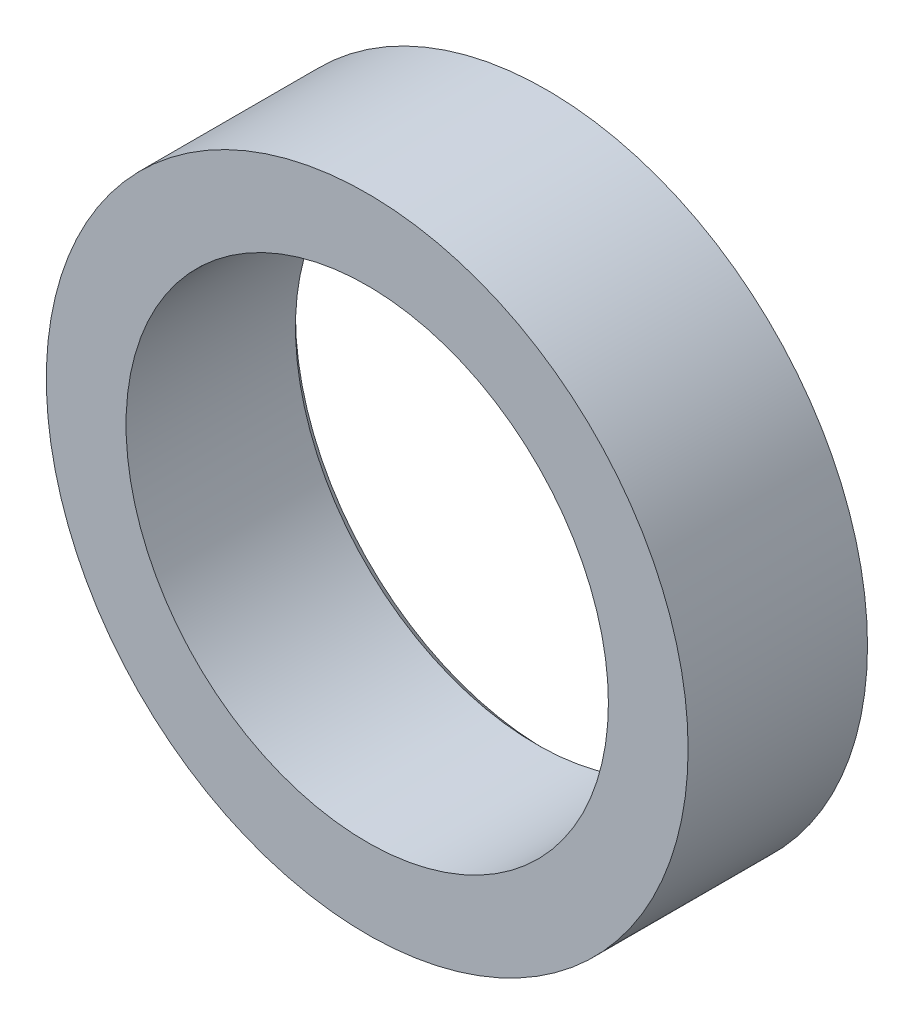
ISO-10303-21;
HEADER;
FILE_DESCRIPTION(('STEP AP214'),'2;1');
FILE_NAME('part.step','',(''),(''),'','','');
FILE_SCHEMA(('AUTOMOTIVE_DESIGN { 1 0 10303 214 1 1 1 1 }'));
ENDSEC;
DATA;
#1=APPLICATION_CONTEXT('core data for automotive mechanical design processes');
#2=APPLICATION_PROTOCOL_DEFINITION('international standard','automotive_design',2000,#1);
#3=PRODUCT_CONTEXT('',#1,'mechanical');
#4=PRODUCT('Part','Part','',(#3));
#5=PRODUCT_RELATED_PRODUCT_CATEGORY('part','',(#4));
#6=PRODUCT_DEFINITION_FORMATION('','',#4);
#7=PRODUCT_DEFINITION_CONTEXT('part definition',#1,'design');
#8=PRODUCT_DEFINITION('design','',#6,#7);
#9=PRODUCT_DEFINITION_SHAPE('','',#8);
#10=(LENGTH_UNIT() NAMED_UNIT(*) SI_UNIT(.MILLI.,.METRE.));
#11=(NAMED_UNIT(*) PLANE_ANGLE_UNIT() SI_UNIT($,.RADIAN.));
#12=(NAMED_UNIT(*) SI_UNIT($,.STERADIAN.) SOLID_ANGLE_UNIT());
#13=UNCERTAINTY_MEASURE_WITH_UNIT(LENGTH_MEASURE(1.E-05),#10,'distance_accuracy_value','');
#14=(GEOMETRIC_REPRESENTATION_CONTEXT(3) GLOBAL_UNCERTAINTY_ASSIGNED_CONTEXT((#13)) GLOBAL_UNIT_ASSIGNED_CONTEXT((#10,
#11,#12)) REPRESENTATION_CONTEXT('',''));
#15=CARTESIAN_POINT('',(0.,0.,0.));
#16=DIRECTION('',(0.,0.,1.));
#17=DIRECTION('',(1.,0.,0.));
#18=AXIS2_PLACEMENT_3D('',#15,#16,#17);
#19=CARTESIAN_POINT('',(0.,0.,9.));
#20=DIRECTION('',(0.,0.,1.));
#21=DIRECTION('',(1.,0.,0.));
#22=AXIS2_PLACEMENT_3D('',#19,#20,#21);
#23=PLANE('',#22);
#24=CARTESIAN_POINT('',(0.,0.,9.));
#25=DIRECTION('',(0.,0.,1.));
#26=DIRECTION('',(1.,0.,0.));
#27=AXIS2_PLACEMENT_3D('',#24,#25,#26);
#28=CIRCLE('',#27,16.1);
#29=CARTESIAN_POINT('',(16.1,0.,9.));
#30=VERTEX_POINT('',#29);
#31=EDGE_CURVE('E45',#30,#30,#28,.T.);
#32=ORIENTED_EDGE('',*,*,#31,.T.);
#33=EDGE_LOOP('',(#32));
#34=FACE_BOUND('',#33,.T.);
#35=CARTESIAN_POINT('',(0.,0.,9.));
#36=DIRECTION('',(0.,0.,1.));
#37=DIRECTION('',(1.,0.,0.));
#38=AXIS2_PLACEMENT_3D('',#35,#36,#37);
#39=CIRCLE('',#38,12.1);
#40=CARTESIAN_POINT('',(12.1,0.,9.));
#41=VERTEX_POINT('',#40);
#42=EDGE_CURVE('E53',#41,#41,#39,.T.);
#43=ORIENTED_EDGE('',*,*,#42,.F.);
#44=EDGE_LOOP('',(#43));
#45=FACE_BOUND('',#44,.T.);
#46=ADVANCED_FACE('F33',(#34,#45),#23,.T.);
#47=CARTESIAN_POINT('',(0.,0.,0.));
#48=DIRECTION('',(0.,0.,1.));
#49=DIRECTION('',(1.,0.,0.));
#50=AXIS2_PLACEMENT_3D('',#47,#48,#49);
#51=PLANE('',#50);
#52=CARTESIAN_POINT('',(0.,0.,0.));
#53=DIRECTION('',(0.,0.,1.));
#54=DIRECTION('',(1.,0.,0.));
#55=AXIS2_PLACEMENT_3D('',#52,#53,#54);
#56=CIRCLE('',#55,12.6);
#57=CARTESIAN_POINT('',(12.6,0.,0.));
#58=VERTEX_POINT('',#57);
#59=EDGE_CURVE('E41',#58,#58,#56,.T.);
#60=ORIENTED_EDGE('',*,*,#59,.T.);
#61=EDGE_LOOP('',(#60));
#62=FACE_BOUND('',#61,.T.);
#63=CARTESIAN_POINT('',(0.,0.,0.));
#64=DIRECTION('',(0.,0.,1.));
#65=DIRECTION('',(1.,0.,0.));
#66=AXIS2_PLACEMENT_3D('',#63,#64,#65);
#67=CIRCLE('',#66,16.1);
#68=CARTESIAN_POINT('',(16.1,0.,0.));
#69=VERTEX_POINT('',#68);
#70=EDGE_CURVE('E49',#69,#69,#67,.T.);
#71=ORIENTED_EDGE('',*,*,#70,.F.);
#72=EDGE_LOOP('',(#71));
#73=FACE_BOUND('',#72,.T.);
#74=ADVANCED_FACE('F61',(#62,#73),#51,.F.);
#75=CARTESIAN_POINT('',(0.,0.,9.));
#76=DIRECTION('',(0.,0.,-1.));
#77=DIRECTION('',(-1.,0.,0.));
#78=AXIS2_PLACEMENT_3D('',#75,#76,#77);
#79=CYLINDRICAL_SURFACE('',#78,16.1);
#80=ORIENTED_EDGE('',*,*,#31,.F.);
#81=EDGE_LOOP('',(#80));
#82=FACE_BOUND('',#81,.T.);
#83=ORIENTED_EDGE('',*,*,#70,.T.);
#84=EDGE_LOOP('',(#83));
#85=FACE_BOUND('',#84,.T.);
#86=ADVANCED_FACE('F67',(#82,#85),#79,.T.);
#87=CARTESIAN_POINT('',(0.,0.,9.));
#88=DIRECTION('',(0.,0.,-1.));
#89=DIRECTION('',(-1.,0.,0.));
#90=AXIS2_PLACEMENT_3D('',#87,#88,#89);
#91=CYLINDRICAL_SURFACE('',#90,12.1);
#92=CARTESIAN_POINT('',(0.,0.,0.500000000000004));
#93=DIRECTION('',(0.,0.,1.));
#94=DIRECTION('',(1.,0.,0.));
#95=AXIS2_PLACEMENT_3D('',#92,#93,#94);
#96=CIRCLE('',#95,12.1);
#97=CARTESIAN_POINT('',(12.1,0.,0.500000000000004));
#98=VERTEX_POINT('',#97);
#99=EDGE_CURVE('E10',#98,#98,#96,.F.);
#100=ORIENTED_EDGE('',*,*,#99,.T.);
#101=EDGE_LOOP('',(#100));
#102=FACE_BOUND('',#101,.T.);
#103=ORIENTED_EDGE('',*,*,#42,.T.);
#104=EDGE_LOOP('',(#103));
#105=FACE_BOUND('',#104,.T.);
#106=ADVANCED_FACE('F58',(#102,#105),#91,.F.);
#107=CARTESIAN_POINT('',(0.,0.,0.));
#108=DIRECTION('',(0.,0.,-1.));
#109=DIRECTION('',(-1.,0.,0.));
#110=AXIS2_PLACEMENT_3D('',#107,#108,#109);
#111=CONICAL_SURFACE('',#110,12.6,0.785398163397441);
#112=ORIENTED_EDGE('',*,*,#99,.F.);
#113=EDGE_LOOP('',(#112));
#114=FACE_BOUND('',#113,.T.);
#115=ORIENTED_EDGE('',*,*,#59,.F.);
#116=EDGE_LOOP('',(#115));
#117=FACE_BOUND('',#116,.T.);
#118=ADVANCED_FACE('F36',(#114,#117),#111,.F.);
#119=CLOSED_SHELL('',(#46,#74,#86,#106,#118));
#120=MANIFOLD_SOLID_BREP('B2',#119);
#121=ADVANCED_BREP_SHAPE_REPRESENTATION('',(#18,#120),#14);
#122=SHAPE_DEFINITION_REPRESENTATION(#9,#121);
ENDSEC;
END-ISO-10303-21;
